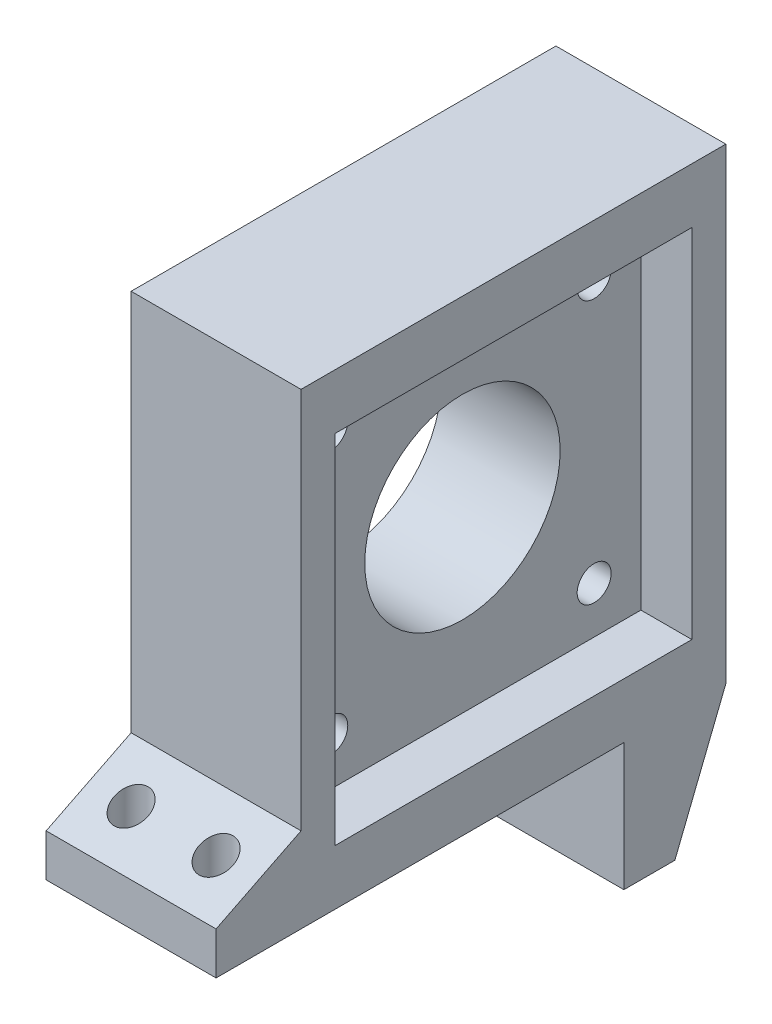
ISO-10303-21;
HEADER;
FILE_DESCRIPTION(('STEP AP214'),'2;1');
FILE_NAME('part.step','',(''),(''),'','','');
FILE_SCHEMA(('AUTOMOTIVE_DESIGN { 1 0 10303 214 1 1 1 1 }'));
ENDSEC;
DATA;
#1=APPLICATION_CONTEXT('core data for automotive mechanical design processes');
#2=APPLICATION_PROTOCOL_DEFINITION('international standard','automotive_design',2000,#1);
#3=PRODUCT_CONTEXT('',#1,'mechanical');
#4=PRODUCT('Part','Part','',(#3));
#5=PRODUCT_RELATED_PRODUCT_CATEGORY('part','',(#4));
#6=PRODUCT_DEFINITION_FORMATION('','',#4);
#7=PRODUCT_DEFINITION_CONTEXT('part definition',#1,'design');
#8=PRODUCT_DEFINITION('design','',#6,#7);
#9=PRODUCT_DEFINITION_SHAPE('','',#8);
#10=(LENGTH_UNIT() NAMED_UNIT(*) SI_UNIT(.MILLI.,.METRE.));
#11=(NAMED_UNIT(*) PLANE_ANGLE_UNIT() SI_UNIT($,.RADIAN.));
#12=(NAMED_UNIT(*) SI_UNIT($,.STERADIAN.) SOLID_ANGLE_UNIT());
#13=UNCERTAINTY_MEASURE_WITH_UNIT(LENGTH_MEASURE(1.E-05),#10,'distance_accuracy_value','');
#14=(GEOMETRIC_REPRESENTATION_CONTEXT(3) GLOBAL_UNCERTAINTY_ASSIGNED_CONTEXT((#13)) GLOBAL_UNIT_ASSIGNED_CONTEXT((#10,
#11,#12)) REPRESENTATION_CONTEXT('',''));
#15=CARTESIAN_POINT('',(0.,0.,0.));
#16=DIRECTION('',(0.,0.,1.));
#17=DIRECTION('',(1.,0.,0.));
#18=AXIS2_PLACEMENT_3D('',#15,#16,#17);
#19=CARTESIAN_POINT('',(0.,70.,50.));
#20=DIRECTION('',(0.,0.,-1.));
#21=DIRECTION('',(-1.,0.,0.));
#22=AXIS2_PLACEMENT_3D('',#19,#20,#21);
#23=PLANE('',#22);
#24=DIRECTION('',(0.,-1.,0.));
#25=VECTOR('',#24,1.);
#26=CARTESIAN_POINT('',(-20.,70.,50.));
#27=LINE('',#26,#25);
#28=CARTESIAN_POINT('',(-20.,70.,50.));
#29=VERTEX_POINT('',#28);
#30=CARTESIAN_POINT('',(-20.,25.,50.));
#31=VERTEX_POINT('',#30);
#32=EDGE_CURVE('E155',#29,#31,#27,.T.);
#33=ORIENTED_EDGE('',*,*,#32,.T.);
#34=DIRECTION('',(1.,0.,0.));
#35=VECTOR('',#34,1.);
#36=CARTESIAN_POINT('',(-20.,25.,50.));
#37=LINE('',#36,#35);
#38=CARTESIAN_POINT('',(0.,25.,50.));
#39=VERTEX_POINT('',#38);
#40=EDGE_CURVE('E135',#31,#39,#37,.T.);
#41=ORIENTED_EDGE('',*,*,#40,.T.);
#42=DIRECTION('',(0.,-1.,0.));
#43=VECTOR('',#42,1.);
#44=CARTESIAN_POINT('',(0.,70.,50.));
#45=LINE('',#44,#43);
#46=CARTESIAN_POINT('',(0.,70.,50.));
#47=VERTEX_POINT('',#46);
#48=EDGE_CURVE('E164',#47,#39,#45,.T.);
#49=ORIENTED_EDGE('',*,*,#48,.F.);
#50=DIRECTION('',(1.,0.,0.));
#51=VECTOR('',#50,1.);
#52=CARTESIAN_POINT('',(0.,70.,50.));
#53=LINE('',#52,#51);
#54=EDGE_CURVE('E161',#29,#47,#53,.T.);
#55=ORIENTED_EDGE('',*,*,#54,.F.);
#56=EDGE_LOOP('',(#33,#41,#49,#55));
#57=FACE_BOUND('',#56,.T.);
#58=ADVANCED_FACE('F39',(#57),#23,.F.);
#59=CARTESIAN_POINT('',(0.,70.,0.));
#60=DIRECTION('',(-1.,0.,0.));
#61=DIRECTION('',(0.,0.,1.));
#62=AXIS2_PLACEMENT_3D('',#59,#60,#61);
#63=PLANE('',#62);
#64=ORIENTED_EDGE('',*,*,#48,.T.);
#65=DIRECTION('',(0.,-0.447213595499958,0.894427190999916));
#66=VECTOR('',#65,1.);
#67=CARTESIAN_POINT('',(0.,20.,60.));
#68=LINE('',#67,#66);
#69=CARTESIAN_POINT('',(0.,20.,60.));
#70=VERTEX_POINT('',#69);
#71=EDGE_CURVE('E141',#39,#70,#68,.T.);
#72=ORIENTED_EDGE('',*,*,#71,.T.);
#73=DIRECTION('',(0.,1.,0.));
#74=VECTOR('',#73,1.);
#75=CARTESIAN_POINT('',(0.,15.,60.));
#76=LINE('',#75,#74);
#77=CARTESIAN_POINT('',(0.,15.,60.));
#78=VERTEX_POINT('',#77);
#79=EDGE_CURVE('E147',#78,#70,#76,.T.);
#80=ORIENTED_EDGE('',*,*,#79,.F.);
#81=DIRECTION('',(0.,0.,1.));
#82=VECTOR('',#81,1.);
#83=CARTESIAN_POINT('',(0.,15.,50.));
#84=LINE('',#83,#82);
#85=CARTESIAN_POINT('',(0.,15.,12.));
#86=VERTEX_POINT('',#85);
#87=EDGE_CURVE('E323',#86,#78,#84,.T.);
#88=ORIENTED_EDGE('',*,*,#87,.F.);
#89=DIRECTION('',(0.,1.,0.));
#90=VECTOR('',#89,1.);
#91=CARTESIAN_POINT('',(0.,0.,12.));
#92=LINE('',#91,#90);
#93=CARTESIAN_POINT('',(0.,0.,12.));
#94=VERTEX_POINT('',#93);
#95=EDGE_CURVE('E202',#94,#86,#92,.T.);
#96=ORIENTED_EDGE('',*,*,#95,.F.);
#97=DIRECTION('',(0.,0.,-1.));
#98=VECTOR('',#97,1.);
#99=CARTESIAN_POINT('',(0.,0.,0.));
#100=LINE('',#99,#98);
#101=CARTESIAN_POINT('',(0.,0.,6.));
#102=VERTEX_POINT('',#101);
#103=EDGE_CURVE('E196',#94,#102,#100,.T.);
#104=ORIENTED_EDGE('',*,*,#103,.T.);
#105=DIRECTION('',(0.,-0.928476690885259,0.371390676354103));
#106=VECTOR('',#105,1.);
#107=CARTESIAN_POINT('',(0.,15.,0.));
#108=LINE('',#107,#106);
#109=CARTESIAN_POINT('',(0.,15.,0.));
#110=VERTEX_POINT('',#109);
#111=EDGE_CURVE('E57',#110,#102,#108,.T.);
#112=ORIENTED_EDGE('',*,*,#111,.F.);
#113=DIRECTION('',(0.,-1.,0.));
#114=VECTOR('',#113,1.);
#115=CARTESIAN_POINT('',(0.,70.,0.));
#116=LINE('',#115,#114);
#117=CARTESIAN_POINT('',(0.,70.,0.));
#118=VERTEX_POINT('',#117);
#119=EDGE_CURVE('E49',#118,#110,#116,.T.);
#120=ORIENTED_EDGE('',*,*,#119,.F.);
#121=DIRECTION('',(0.,0.,-1.));
#122=VECTOR('',#121,1.);
#123=CARTESIAN_POINT('',(0.,70.,0.));
#124=LINE('',#123,#122);
#125=EDGE_CURVE('E335',#47,#118,#124,.T.);
#126=ORIENTED_EDGE('',*,*,#125,.F.);
#127=EDGE_LOOP('',(#64,#72,#80,#88,#96,#104,#112,#120,#126));
#128=FACE_BOUND('',#127,.T.);
#129=DIRECTION('',(0.,0.,1.));
#130=VECTOR('',#129,1.);
#131=CARTESIAN_POINT('',(0.,63.5,4.));
#132=LINE('',#131,#130);
#133=CARTESIAN_POINT('',(0.,63.5,4.));
#134=VERTEX_POINT('',#133);
#135=CARTESIAN_POINT('',(0.,63.5,46.));
#136=VERTEX_POINT('',#135);
#137=EDGE_CURVE('E285',#134,#136,#132,.T.);
#138=ORIENTED_EDGE('',*,*,#137,.F.);
#139=DIRECTION('',(0.,1.,0.));
#140=VECTOR('',#139,1.);
#141=CARTESIAN_POINT('',(0.,63.5,4.));
#142=LINE('',#141,#140);
#143=CARTESIAN_POINT('',(0.,21.5,3.99999999999999));
#144=VERTEX_POINT('',#143);
#145=EDGE_CURVE('E65',#144,#134,#142,.T.);
#146=ORIENTED_EDGE('',*,*,#145,.F.);
#147=DIRECTION('',(0.,0.,-1.));
#148=VECTOR('',#147,1.);
#149=CARTESIAN_POINT('',(0.,21.5,3.99999999999999));
#150=LINE('',#149,#148);
#151=CARTESIAN_POINT('',(0.,21.5,46.));
#152=VERTEX_POINT('',#151);
#153=EDGE_CURVE('E270',#152,#144,#150,.T.);
#154=ORIENTED_EDGE('',*,*,#153,.F.);
#155=DIRECTION('',(0.,-1.,0.));
#156=VECTOR('',#155,1.);
#157=CARTESIAN_POINT('',(0.,63.5,46.));
#158=LINE('',#157,#156);
#159=EDGE_CURVE('E289',#136,#152,#158,.T.);
#160=ORIENTED_EDGE('',*,*,#159,.F.);
#161=EDGE_LOOP('',(#138,#146,#154,#160));
#162=FACE_BOUND('',#161,.T.);
#163=ADVANCED_FACE('F41',(#128,#162),#63,.F.);
#164=CARTESIAN_POINT('',(0.,70.,0.));
#165=DIRECTION('',(0.,0.,1.));
#166=DIRECTION('',(1.,0.,0.));
#167=AXIS2_PLACEMENT_3D('',#164,#165,#166);
#168=PLANE('',#167);
#169=ORIENTED_EDGE('',*,*,#119,.T.);
#170=DIRECTION('',(1.,0.,0.));
#171=VECTOR('',#170,1.);
#172=CARTESIAN_POINT('',(-30.,15.,0.));
#173=LINE('',#172,#171);
#174=CARTESIAN_POINT('',(-20.,15.,0.));
#175=VERTEX_POINT('',#174);
#176=EDGE_CURVE('E214',#175,#110,#173,.T.);
#177=ORIENTED_EDGE('',*,*,#176,.F.);
#178=DIRECTION('',(0.,-1.,0.));
#179=VECTOR('',#178,1.);
#180=CARTESIAN_POINT('',(-20.,70.,0.));
#181=LINE('',#180,#179);
#182=CARTESIAN_POINT('',(-20.,70.,0.));
#183=VERTEX_POINT('',#182);
#184=EDGE_CURVE('E163',#183,#175,#181,.T.);
#185=ORIENTED_EDGE('',*,*,#184,.F.);
#186=DIRECTION('',(-1.,0.,0.));
#187=VECTOR('',#186,1.);
#188=CARTESIAN_POINT('',(0.,70.,0.));
#189=LINE('',#188,#187);
#190=EDGE_CURVE('E339',#118,#183,#189,.T.);
#191=ORIENTED_EDGE('',*,*,#190,.F.);
#192=EDGE_LOOP('',(#169,#177,#185,#191));
#193=FACE_BOUND('',#192,.T.);
#194=ADVANCED_FACE('F377',(#193),#168,.F.);
#195=CARTESIAN_POINT('',(-20.,70.,0.));
#196=DIRECTION('',(1.,0.,0.));
#197=DIRECTION('',(0.,0.,-1.));
#198=AXIS2_PLACEMENT_3D('',#195,#196,#197);
#199=PLANE('',#198);
#200=DIRECTION('',(0.,-0.447213595499958,0.894427190999916));
#201=VECTOR('',#200,1.);
#202=CARTESIAN_POINT('',(-20.,20.,60.));
#203=LINE('',#202,#201);
#204=CARTESIAN_POINT('',(-20.,20.,60.));
#205=VERTEX_POINT('',#204);
#206=EDGE_CURVE('E138',#31,#205,#203,.T.);
#207=ORIENTED_EDGE('',*,*,#206,.F.);
#208=ORIENTED_EDGE('',*,*,#32,.F.);
#209=DIRECTION('',(0.,0.,1.));
#210=VECTOR('',#209,1.);
#211=CARTESIAN_POINT('',(-20.,70.,0.));
#212=LINE('',#211,#210);
#213=EDGE_CURVE('E343',#183,#29,#212,.T.);
#214=ORIENTED_EDGE('',*,*,#213,.F.);
#215=ORIENTED_EDGE('',*,*,#184,.T.);
#216=DIRECTION('',(0.,-0.92847669088526,0.371390676354103));
#217=VECTOR('',#216,1.);
#218=CARTESIAN_POINT('',(-20.,62.4137931034483,-18.9655172413793));
#219=LINE('',#218,#217);
#220=CARTESIAN_POINT('',(-20.,0.,6.));
#221=VERTEX_POINT('',#220);
#222=EDGE_CURVE('E257',#175,#221,#219,.T.);
#223=ORIENTED_EDGE('',*,*,#222,.T.);
#224=DIRECTION('',(0.,0.,1.));
#225=VECTOR('',#224,1.);
#226=CARTESIAN_POINT('',(-20.,0.,0.));
#227=LINE('',#226,#225);
#228=CARTESIAN_POINT('',(-20.,0.,12.));
#229=VERTEX_POINT('',#228);
#230=EDGE_CURVE('E340',#221,#229,#227,.T.);
#231=ORIENTED_EDGE('',*,*,#230,.T.);
#232=DIRECTION('',(0.,1.,0.));
#233=VECTOR('',#232,1.);
#234=CARTESIAN_POINT('',(-20.,70.,12.));
#235=LINE('',#234,#233);
#236=CARTESIAN_POINT('',(-20.,15.,12.));
#237=VERTEX_POINT('',#236);
#238=EDGE_CURVE('E329',#229,#237,#235,.T.);
#239=ORIENTED_EDGE('',*,*,#238,.T.);
#240=DIRECTION('',(0.,0.,1.));
#241=VECTOR('',#240,1.);
#242=CARTESIAN_POINT('',(-20.,15.,0.));
#243=LINE('',#242,#241);
#244=CARTESIAN_POINT('',(-20.,15.,60.));
#245=VERTEX_POINT('',#244);
#246=EDGE_CURVE('E181',#237,#245,#243,.T.);
#247=ORIENTED_EDGE('',*,*,#246,.T.);
#248=DIRECTION('',(0.,-1.,0.));
#249=VECTOR('',#248,1.);
#250=CARTESIAN_POINT('',(-20.,15.,60.));
#251=LINE('',#250,#249);
#252=EDGE_CURVE('E158',#205,#245,#251,.T.);
#253=ORIENTED_EDGE('',*,*,#252,.F.);
#254=EDGE_LOOP('',(#207,#208,#214,#215,#223,#231,#239,#247,#253));
#255=FACE_BOUND('',#254,.T.);
#256=CARTESIAN_POINT('',(-20.,42.5,25.));
#257=DIRECTION('',(1.,0.,0.));
#258=DIRECTION('',(0.,0.,-1.));
#259=AXIS2_PLACEMENT_3D('',#256,#257,#258);
#260=CIRCLE('',#259,11.5);
#261=CARTESIAN_POINT('',(-20.,42.5,13.5));
#262=VERTEX_POINT('',#261);
#263=EDGE_CURVE('E193',#262,#262,#260,.T.);
#264=ORIENTED_EDGE('',*,*,#263,.T.);
#265=EDGE_LOOP('',(#264));
#266=FACE_BOUND('',#265,.T.);
#267=CARTESIAN_POINT('',(-20.,58.,40.5));
#268=DIRECTION('',(1.,0.,0.));
#269=DIRECTION('',(0.,0.,-1.));
#270=AXIS2_PLACEMENT_3D('',#267,#268,#269);
#271=CIRCLE('',#270,2.00000000000001);
#272=CARTESIAN_POINT('',(-20.,58.,38.5));
#273=VERTEX_POINT('',#272);
#274=EDGE_CURVE('E189',#273,#273,#271,.T.);
#275=ORIENTED_EDGE('',*,*,#274,.T.);
#276=EDGE_LOOP('',(#275));
#277=FACE_BOUND('',#276,.T.);
#278=CARTESIAN_POINT('',(-20.,27.,40.5));
#279=DIRECTION('',(1.,0.,0.));
#280=DIRECTION('',(0.,0.,-1.));
#281=AXIS2_PLACEMENT_3D('',#278,#279,#280);
#282=CIRCLE('',#281,2.);
#283=CARTESIAN_POINT('',(-20.,27.,38.5));
#284=VERTEX_POINT('',#283);
#285=EDGE_CURVE('E185',#284,#284,#282,.T.);
#286=ORIENTED_EDGE('',*,*,#285,.T.);
#287=EDGE_LOOP('',(#286));
#288=FACE_BOUND('',#287,.T.);
#289=CARTESIAN_POINT('',(-20.,27.,9.5));
#290=DIRECTION('',(1.,0.,0.));
#291=DIRECTION('',(0.,0.,-1.));
#292=AXIS2_PLACEMENT_3D('',#289,#290,#291);
#293=CIRCLE('',#292,2.00000000000001);
#294=CARTESIAN_POINT('',(-20.,27.,7.49999999999999));
#295=VERTEX_POINT('',#294);
#296=EDGE_CURVE('E180',#295,#295,#293,.T.);
#297=ORIENTED_EDGE('',*,*,#296,.T.);
#298=EDGE_LOOP('',(#297));
#299=FACE_BOUND('',#298,.T.);
#300=CARTESIAN_POINT('',(-20.,58.,9.5));
#301=DIRECTION('',(1.,0.,0.));
#302=DIRECTION('',(0.,0.,-1.));
#303=AXIS2_PLACEMENT_3D('',#300,#301,#302);
#304=CIRCLE('',#303,2.00000000000001);
#305=CARTESIAN_POINT('',(-20.,58.,7.5));
#306=VERTEX_POINT('',#305);
#307=EDGE_CURVE('E176',#306,#306,#304,.T.);
#308=ORIENTED_EDGE('',*,*,#307,.T.);
#309=EDGE_LOOP('',(#308));
#310=FACE_BOUND('',#309,.T.);
#311=ADVANCED_FACE('F152',(#255,#266,#277,#288,#299,#310),#199,.F.);
#312=CARTESIAN_POINT('',(0.,70.,0.));
#313=DIRECTION('',(0.,-1.,0.));
#314=DIRECTION('',(0.,0.,-1.));
#315=AXIS2_PLACEMENT_3D('',#312,#313,#314);
#316=PLANE('',#315);
#317=ORIENTED_EDGE('',*,*,#125,.T.);
#318=ORIENTED_EDGE('',*,*,#190,.T.);
#319=ORIENTED_EDGE('',*,*,#213,.T.);
#320=ORIENTED_EDGE('',*,*,#54,.T.);
#321=EDGE_LOOP('',(#317,#318,#319,#320));
#322=FACE_BOUND('',#321,.T.);
#323=ADVANCED_FACE('F373',(#322),#316,.F.);
#324=CARTESIAN_POINT('',(0.,0.,0.));
#325=DIRECTION('',(0.,-1.,0.));
#326=DIRECTION('',(0.,0.,-1.));
#327=AXIS2_PLACEMENT_3D('',#324,#325,#326);
#328=PLANE('',#327);
#329=DIRECTION('',(1.,0.,0.));
#330=VECTOR('',#329,1.);
#331=CARTESIAN_POINT('',(-30.,0.,6.));
#332=LINE('',#331,#330);
#333=EDGE_CURVE('E249',#221,#102,#332,.T.);
#334=ORIENTED_EDGE('',*,*,#333,.T.);
#335=ORIENTED_EDGE('',*,*,#103,.F.);
#336=DIRECTION('',(1.,0.,0.));
#337=VECTOR('',#336,1.);
#338=CARTESIAN_POINT('',(0.,0.,12.));
#339=LINE('',#338,#337);
#340=EDGE_CURVE('E11',#229,#94,#339,.T.);
#341=ORIENTED_EDGE('',*,*,#340,.F.);
#342=ORIENTED_EDGE('',*,*,#230,.F.);
#343=EDGE_LOOP('',(#334,#335,#341,#342));
#344=FACE_BOUND('',#343,.T.);
#345=ADVANCED_FACE('F360',(#344),#328,.T.);
#346=CARTESIAN_POINT('',(-60.,58.,9.50000000000001));
#347=DIRECTION('',(1.,0.,0.));
#348=DIRECTION('',(0.,0.,-1.));
#349=AXIS2_PLACEMENT_3D('',#346,#347,#348);
#350=CYLINDRICAL_SURFACE('',#349,2.00000000000001);
#351=CARTESIAN_POINT('',(-6.,58.,9.5));
#352=DIRECTION('',(-1.,0.,0.));
#353=DIRECTION('',(0.,0.,1.));
#354=AXIS2_PLACEMENT_3D('',#351,#352,#353);
#355=CIRCLE('',#354,2.00000000000001);
#356=CARTESIAN_POINT('',(-6.,58.,11.5));
#357=VERTEX_POINT('',#356);
#358=EDGE_CURVE('E203',#357,#357,#355,.F.);
#359=ORIENTED_EDGE('',*,*,#358,.T.);
#360=EDGE_LOOP('',(#359));
#361=FACE_BOUND('',#360,.T.);
#362=ORIENTED_EDGE('',*,*,#307,.F.);
#363=EDGE_LOOP('',(#362));
#364=FACE_BOUND('',#363,.T.);
#365=ADVANCED_FACE('F423',(#361,#364),#350,.F.);
#366=CARTESIAN_POINT('',(-60.,27.,9.50000000000001));
#367=DIRECTION('',(1.,0.,0.));
#368=DIRECTION('',(0.,0.,-1.));
#369=AXIS2_PLACEMENT_3D('',#366,#367,#368);
#370=CYLINDRICAL_SURFACE('',#369,2.00000000000001);
#371=CARTESIAN_POINT('',(-6.,27.,9.5));
#372=DIRECTION('',(-1.,0.,0.));
#373=DIRECTION('',(0.,0.,1.));
#374=AXIS2_PLACEMENT_3D('',#371,#372,#373);
#375=CIRCLE('',#374,2.00000000000001);
#376=CARTESIAN_POINT('',(-6.,27.,11.5));
#377=VERTEX_POINT('',#376);
#378=EDGE_CURVE('E313',#377,#377,#375,.F.);
#379=ORIENTED_EDGE('',*,*,#378,.T.);
#380=EDGE_LOOP('',(#379));
#381=FACE_BOUND('',#380,.T.);
#382=ORIENTED_EDGE('',*,*,#296,.F.);
#383=EDGE_LOOP('',(#382));
#384=FACE_BOUND('',#383,.T.);
#385=ADVANCED_FACE('F510',(#381,#384),#370,.F.);
#386=CARTESIAN_POINT('',(-60.,27.,40.5));
#387=DIRECTION('',(1.,0.,0.));
#388=DIRECTION('',(0.,0.,-1.));
#389=AXIS2_PLACEMENT_3D('',#386,#387,#388);
#390=CYLINDRICAL_SURFACE('',#389,2.);
#391=CARTESIAN_POINT('',(-5.99999999999999,27.,40.5));
#392=DIRECTION('',(-1.,0.,0.));
#393=DIRECTION('',(0.,0.,1.));
#394=AXIS2_PLACEMENT_3D('',#391,#392,#393);
#395=CIRCLE('',#394,2.);
#396=CARTESIAN_POINT('',(-5.99999999999999,27.,42.5));
#397=VERTEX_POINT('',#396);
#398=EDGE_CURVE('E309',#397,#397,#395,.F.);
#399=ORIENTED_EDGE('',*,*,#398,.T.);
#400=EDGE_LOOP('',(#399));
#401=FACE_BOUND('',#400,.T.);
#402=ORIENTED_EDGE('',*,*,#285,.F.);
#403=EDGE_LOOP('',(#402));
#404=FACE_BOUND('',#403,.T.);
#405=ADVANCED_FACE('F500',(#401,#404),#390,.F.);
#406=CARTESIAN_POINT('',(-60.,58.,40.5));
#407=DIRECTION('',(1.,0.,0.));
#408=DIRECTION('',(0.,0.,-1.));
#409=AXIS2_PLACEMENT_3D('',#406,#407,#408);
#410=CYLINDRICAL_SURFACE('',#409,2.00000000000001);
#411=CARTESIAN_POINT('',(-5.99999999999999,58.,40.5));
#412=DIRECTION('',(-1.,0.,0.));
#413=DIRECTION('',(0.,0.,1.));
#414=AXIS2_PLACEMENT_3D('',#411,#412,#413);
#415=CIRCLE('',#414,2.00000000000001);
#416=CARTESIAN_POINT('',(-5.99999999999999,58.,42.5));
#417=VERTEX_POINT('',#416);
#418=EDGE_CURVE('E208',#417,#417,#415,.F.);
#419=ORIENTED_EDGE('',*,*,#418,.T.);
#420=EDGE_LOOP('',(#419));
#421=FACE_BOUND('',#420,.T.);
#422=ORIENTED_EDGE('',*,*,#274,.F.);
#423=EDGE_LOOP('',(#422));
#424=FACE_BOUND('',#423,.T.);
#425=ADVANCED_FACE('F489',(#421,#424),#410,.F.);
#426=CARTESIAN_POINT('',(-60.,42.5,25.));
#427=DIRECTION('',(1.,0.,0.));
#428=DIRECTION('',(0.,0.,-1.));
#429=AXIS2_PLACEMENT_3D('',#426,#427,#428);
#430=CYLINDRICAL_SURFACE('',#429,11.5);
#431=CARTESIAN_POINT('',(-6.,42.5,25.));
#432=DIRECTION('',(-1.,0.,0.));
#433=DIRECTION('',(0.,0.,1.));
#434=AXIS2_PLACEMENT_3D('',#431,#432,#433);
#435=CIRCLE('',#434,11.5);
#436=CARTESIAN_POINT('',(-6.,42.5,36.5));
#437=VERTEX_POINT('',#436);
#438=EDGE_CURVE('E204',#437,#437,#435,.F.);
#439=ORIENTED_EDGE('',*,*,#438,.T.);
#440=EDGE_LOOP('',(#439));
#441=FACE_BOUND('',#440,.T.);
#442=ORIENTED_EDGE('',*,*,#263,.F.);
#443=EDGE_LOOP('',(#442));
#444=FACE_BOUND('',#443,.T.);
#445=ADVANCED_FACE('F484',(#441,#444),#430,.F.);
#446=CARTESIAN_POINT('',(-60.,15.,50.));
#447=DIRECTION('',(0.,1.,0.));
#448=DIRECTION('',(0.,0.,1.));
#449=AXIS2_PLACEMENT_3D('',#446,#447,#448);
#450=PLANE('',#449);
#451=CARTESIAN_POINT('',(-5.,15.,55.));
#452=DIRECTION('',(0.,-1.,0.));
#453=DIRECTION('',(0.,0.,-1.));
#454=AXIS2_PLACEMENT_3D('',#451,#452,#453);
#455=CIRCLE('',#454,2.);
#456=CARTESIAN_POINT('',(-5.,15.,53.));
#457=VERTEX_POINT('',#456);
#458=EDGE_CURVE('E218',#457,#457,#455,.T.);
#459=ORIENTED_EDGE('',*,*,#458,.F.);
#460=EDGE_LOOP('',(#459));
#461=FACE_BOUND('',#460,.T.);
#462=CARTESIAN_POINT('',(-15.,15.,55.));
#463=DIRECTION('',(0.,-1.,0.));
#464=DIRECTION('',(0.,0.,-1.));
#465=AXIS2_PLACEMENT_3D('',#462,#463,#464);
#466=CIRCLE('',#465,2.);
#467=CARTESIAN_POINT('',(-15.,15.,53.));
#468=VERTEX_POINT('',#467);
#469=EDGE_CURVE('E225',#468,#468,#466,.T.);
#470=ORIENTED_EDGE('',*,*,#469,.F.);
#471=EDGE_LOOP('',(#470));
#472=FACE_BOUND('',#471,.T.);
#473=DIRECTION('',(1.,0.,0.));
#474=VECTOR('',#473,1.);
#475=CARTESIAN_POINT('',(-60.,15.,12.));
#476=LINE('',#475,#474);
#477=EDGE_CURVE('E326',#237,#86,#476,.T.);
#478=ORIENTED_EDGE('',*,*,#477,.T.);
#479=ORIENTED_EDGE('',*,*,#87,.T.);
#480=DIRECTION('',(1.,0.,0.));
#481=VECTOR('',#480,1.);
#482=CARTESIAN_POINT('',(0.,15.,60.));
#483=LINE('',#482,#481);
#484=EDGE_CURVE('E243',#245,#78,#483,.T.);
#485=ORIENTED_EDGE('',*,*,#484,.F.);
#486=ORIENTED_EDGE('',*,*,#246,.F.);
#487=EDGE_LOOP('',(#478,#479,#485,#486));
#488=FACE_BOUND('',#487,.T.);
#489=ADVANCED_FACE('F368',(#461,#472,#488),#450,.F.);
#490=CARTESIAN_POINT('',(-60.,0.,12.));
#491=DIRECTION('',(0.,0.,-1.));
#492=DIRECTION('',(-1.,0.,0.));
#493=AXIS2_PLACEMENT_3D('',#490,#491,#492);
#494=PLANE('',#493);
#495=CARTESIAN_POINT('',(-15.,6.,12.));
#496=DIRECTION('',(0.,0.,-1.));
#497=DIRECTION('',(-1.,0.,0.));
#498=AXIS2_PLACEMENT_3D('',#495,#496,#497);
#499=CIRCLE('',#498,2.);
#500=CARTESIAN_POINT('',(-17.,6.,12.));
#501=VERTEX_POINT('',#500);
#502=EDGE_CURVE('E198',#501,#501,#499,.T.);
#503=ORIENTED_EDGE('',*,*,#502,.T.);
#504=EDGE_LOOP('',(#503));
#505=FACE_BOUND('',#504,.T.);
#506=ORIENTED_EDGE('',*,*,#340,.T.);
#507=ORIENTED_EDGE('',*,*,#95,.T.);
#508=ORIENTED_EDGE('',*,*,#477,.F.);
#509=ORIENTED_EDGE('',*,*,#238,.F.);
#510=EDGE_LOOP('',(#506,#507,#508,#509));
#511=FACE_BOUND('',#510,.T.);
#512=ADVANCED_FACE('F357',(#505,#511),#494,.F.);
#513=CARTESIAN_POINT('',(-15.,6.,15.));
#514=DIRECTION('',(0.,0.,-1.));
#515=DIRECTION('',(-1.,0.,0.));
#516=AXIS2_PLACEMENT_3D('',#513,#514,#515);
#517=CYLINDRICAL_SURFACE('',#516,2.);
#518=CARTESIAN_POINT('',(-15.,6.,3.6));
#519=DIRECTION('',(0.,0.371390676354103,0.928476690885259));
#520=DIRECTION('',(0.,0.92847669088526,-0.371390676354103));
#521=AXIS2_PLACEMENT_3D('',#518,#519,#520);
#522=ELLIPSE('',#521,2.1540659228538,2.);
#523=CARTESIAN_POINT('',(-15.,8.,2.8));
#524=VERTEX_POINT('',#523);
#525=EDGE_CURVE('E213',#524,#524,#522,.F.);
#526=ORIENTED_EDGE('',*,*,#525,.T.);
#527=EDGE_LOOP('',(#526));
#528=FACE_BOUND('',#527,.T.);
#529=ORIENTED_EDGE('',*,*,#502,.F.);
#530=EDGE_LOOP('',(#529));
#531=FACE_BOUND('',#530,.T.);
#532=ADVANCED_FACE('F427',(#528,#531),#517,.F.);
#533=CARTESIAN_POINT('',(-6.,0.,0.));
#534=DIRECTION('',(-1.,0.,0.));
#535=DIRECTION('',(0.,0.,1.));
#536=AXIS2_PLACEMENT_3D('',#533,#534,#535);
#537=PLANE('',#536);
#538=ORIENTED_EDGE('',*,*,#378,.F.);
#539=EDGE_LOOP('',(#538));
#540=FACE_BOUND('',#539,.T.);
#541=ORIENTED_EDGE('',*,*,#418,.F.);
#542=EDGE_LOOP('',(#541));
#543=FACE_BOUND('',#542,.T.);
#544=DIRECTION('',(0.,1.,0.));
#545=VECTOR('',#544,1.);
#546=CARTESIAN_POINT('',(-6.,63.5,4.));
#547=LINE('',#546,#545);
#548=CARTESIAN_POINT('',(-6.,21.5,3.99999999999999));
#549=VERTEX_POINT('',#548);
#550=CARTESIAN_POINT('',(-6.,63.5,4.));
#551=VERTEX_POINT('',#550);
#552=EDGE_CURVE('E265',#549,#551,#547,.T.);
#553=ORIENTED_EDGE('',*,*,#552,.T.);
#554=DIRECTION('',(0.,0.,1.));
#555=VECTOR('',#554,1.);
#556=CARTESIAN_POINT('',(-6.,63.5,4.));
#557=LINE('',#556,#555);
#558=CARTESIAN_POINT('',(-5.99999999999999,63.5,46.));
#559=VERTEX_POINT('',#558);
#560=EDGE_CURVE('E269',#551,#559,#557,.T.);
#561=ORIENTED_EDGE('',*,*,#560,.T.);
#562=DIRECTION('',(0.,-1.,0.));
#563=VECTOR('',#562,1.);
#564=CARTESIAN_POINT('',(-5.99999999999999,63.5,46.));
#565=LINE('',#564,#563);
#566=CARTESIAN_POINT('',(-5.99999999999999,21.5,46.));
#567=VERTEX_POINT('',#566);
#568=EDGE_CURVE('E274',#559,#567,#565,.T.);
#569=ORIENTED_EDGE('',*,*,#568,.T.);
#570=DIRECTION('',(0.,0.,-1.));
#571=VECTOR('',#570,1.);
#572=CARTESIAN_POINT('',(-6.,21.5,3.99999999999999));
#573=LINE('',#572,#571);
#574=EDGE_CURVE('E278',#567,#549,#573,.T.);
#575=ORIENTED_EDGE('',*,*,#574,.T.);
#576=EDGE_LOOP('',(#553,#561,#569,#575));
#577=FACE_BOUND('',#576,.T.);
#578=ORIENTED_EDGE('',*,*,#438,.F.);
#579=EDGE_LOOP('',(#578));
#580=FACE_BOUND('',#579,.T.);
#581=ORIENTED_EDGE('',*,*,#398,.F.);
#582=EDGE_LOOP('',(#581));
#583=FACE_BOUND('',#582,.T.);
#584=ORIENTED_EDGE('',*,*,#358,.F.);
#585=EDGE_LOOP('',(#584));
#586=FACE_BOUND('',#585,.T.);
#587=ADVANCED_FACE('F430',(#540,#543,#577,#580,#583,#586),#537,.F.);
#588=CARTESIAN_POINT('',(-6.,63.5,4.));
#589=DIRECTION('',(0.,0.,-1.));
#590=DIRECTION('',(0.,1.,0.));
#591=AXIS2_PLACEMENT_3D('',#588,#589,#590);
#592=PLANE('',#591);
#593=ORIENTED_EDGE('',*,*,#145,.T.);
#594=DIRECTION('',(1.,0.,0.));
#595=VECTOR('',#594,1.);
#596=CARTESIAN_POINT('',(-6.,63.5,4.));
#597=LINE('',#596,#595);
#598=EDGE_CURVE('E282',#551,#134,#597,.T.);
#599=ORIENTED_EDGE('',*,*,#598,.F.);
#600=ORIENTED_EDGE('',*,*,#552,.F.);
#601=DIRECTION('',(1.,0.,0.));
#602=VECTOR('',#601,1.);
#603=CARTESIAN_POINT('',(-6.,21.5,3.99999999999999));
#604=LINE('',#603,#602);
#605=EDGE_CURVE('E209',#549,#144,#604,.T.);
#606=ORIENTED_EDGE('',*,*,#605,.T.);
#607=EDGE_LOOP('',(#593,#599,#600,#606));
#608=FACE_BOUND('',#607,.T.);
#609=ADVANCED_FACE('F465',(#608),#592,.F.);
#610=CARTESIAN_POINT('',(-6.,21.5,3.99999999999999));
#611=DIRECTION('',(0.,-1.,0.));
#612=DIRECTION('',(0.,0.,-1.));
#613=AXIS2_PLACEMENT_3D('',#610,#611,#612);
#614=PLANE('',#613);
#615=ORIENTED_EDGE('',*,*,#153,.T.);
#616=ORIENTED_EDGE('',*,*,#605,.F.);
#617=ORIENTED_EDGE('',*,*,#574,.F.);
#618=DIRECTION('',(1.,0.,0.));
#619=VECTOR('',#618,1.);
#620=CARTESIAN_POINT('',(-5.99999999999999,21.5,46.));
#621=LINE('',#620,#619);
#622=EDGE_CURVE('E298',#567,#152,#621,.T.);
#623=ORIENTED_EDGE('',*,*,#622,.T.);
#624=EDGE_LOOP('',(#615,#616,#617,#623));
#625=FACE_BOUND('',#624,.T.);
#626=ADVANCED_FACE('F457',(#625),#614,.F.);
#627=CARTESIAN_POINT('',(-5.99999999999999,63.5,46.));
#628=DIRECTION('',(0.,0.,1.));
#629=DIRECTION('',(0.,-1.,0.));
#630=AXIS2_PLACEMENT_3D('',#627,#628,#629);
#631=PLANE('',#630);
#632=ORIENTED_EDGE('',*,*,#159,.T.);
#633=ORIENTED_EDGE('',*,*,#622,.F.);
#634=ORIENTED_EDGE('',*,*,#568,.F.);
#635=DIRECTION('',(1.,0.,0.));
#636=VECTOR('',#635,1.);
#637=CARTESIAN_POINT('',(-5.99999999999999,63.5,46.));
#638=LINE('',#637,#636);
#639=EDGE_CURVE('E301',#559,#136,#638,.T.);
#640=ORIENTED_EDGE('',*,*,#639,.T.);
#641=EDGE_LOOP('',(#632,#633,#634,#640));
#642=FACE_BOUND('',#641,.T.);
#643=ADVANCED_FACE('F392',(#642),#631,.F.);
#644=CARTESIAN_POINT('',(-6.,63.5,4.));
#645=DIRECTION('',(0.,1.,0.));
#646=DIRECTION('',(0.,0.,1.));
#647=AXIS2_PLACEMENT_3D('',#644,#645,#646);
#648=PLANE('',#647);
#649=ORIENTED_EDGE('',*,*,#137,.T.);
#650=ORIENTED_EDGE('',*,*,#639,.F.);
#651=ORIENTED_EDGE('',*,*,#560,.F.);
#652=ORIENTED_EDGE('',*,*,#598,.T.);
#653=EDGE_LOOP('',(#649,#650,#651,#652));
#654=FACE_BOUND('',#653,.T.);
#655=ADVANCED_FACE('F381',(#654),#648,.F.);
#656=CARTESIAN_POINT('',(-30.,15.,0.));
#657=DIRECTION('',(0.,0.371390676354103,0.928476690885259));
#658=DIRECTION('',(0.,-0.92847669088526,0.371390676354103));
#659=AXIS2_PLACEMENT_3D('',#656,#657,#658);
#660=PLANE('',#659);
#661=CARTESIAN_POINT('',(-5.,6.,3.6));
#662=DIRECTION('',(0.,0.371390676354103,0.928476690885259));
#663=DIRECTION('',(0.,0.92847669088526,-0.371390676354103));
#664=AXIS2_PLACEMENT_3D('',#661,#662,#663);
#665=ELLIPSE('',#664,2.1540659228538,2.);
#666=CARTESIAN_POINT('',(-5.,8.,2.8));
#667=VERTEX_POINT('',#666);
#668=EDGE_CURVE('E210',#667,#667,#665,.F.);
#669=ORIENTED_EDGE('',*,*,#668,.F.);
#670=EDGE_LOOP('',(#669));
#671=FACE_BOUND('',#670,.T.);
#672=ORIENTED_EDGE('',*,*,#525,.F.);
#673=EDGE_LOOP('',(#672));
#674=FACE_BOUND('',#673,.T.);
#675=ORIENTED_EDGE('',*,*,#176,.T.);
#676=ORIENTED_EDGE('',*,*,#111,.T.);
#677=ORIENTED_EDGE('',*,*,#333,.F.);
#678=ORIENTED_EDGE('',*,*,#222,.F.);
#679=EDGE_LOOP('',(#675,#676,#677,#678));
#680=FACE_BOUND('',#679,.T.);
#681=ADVANCED_FACE('F378',(#671,#674,#680),#660,.F.);
#682=CARTESIAN_POINT('',(-5.,6.,7.));
#683=DIRECTION('',(0.,0.,-1.));
#684=DIRECTION('',(-1.,0.,0.));
#685=AXIS2_PLACEMENT_3D('',#682,#683,#684);
#686=PLANE('',#685);
#687=CARTESIAN_POINT('',(-5.,6.,7.));
#688=DIRECTION('',(0.,0.,-1.));
#689=DIRECTION('',(-1.,0.,0.));
#690=AXIS2_PLACEMENT_3D('',#687,#688,#689);
#691=CIRCLE('',#690,2.);
#692=CARTESIAN_POINT('',(-7.,6.,7.));
#693=VERTEX_POINT('',#692);
#694=EDGE_CURVE('E261',#693,#693,#691,.T.);
#695=ORIENTED_EDGE('',*,*,#694,.T.);
#696=EDGE_LOOP('',(#695));
#697=FACE_BOUND('',#696,.T.);
#698=ADVANCED_FACE('F380',(#697),#686,.T.);
#699=CARTESIAN_POINT('',(-5.,6.,7.));
#700=DIRECTION('',(0.,0.,-1.));
#701=DIRECTION('',(-1.,0.,0.));
#702=AXIS2_PLACEMENT_3D('',#699,#700,#701);
#703=CYLINDRICAL_SURFACE('',#702,2.);
#704=ORIENTED_EDGE('',*,*,#668,.T.);
#705=EDGE_LOOP('',(#704));
#706=FACE_BOUND('',#705,.T.);
#707=ORIENTED_EDGE('',*,*,#694,.F.);
#708=EDGE_LOOP('',(#707));
#709=FACE_BOUND('',#708,.T.);
#710=ADVANCED_FACE('F388',(#706,#709),#703,.F.);
#711=CARTESIAN_POINT('',(0.,0.,60.));
#712=DIRECTION('',(0.,0.,1.));
#713=DIRECTION('',(1.,0.,0.));
#714=AXIS2_PLACEMENT_3D('',#711,#712,#713);
#715=PLANE('',#714);
#716=ORIENTED_EDGE('',*,*,#79,.T.);
#717=DIRECTION('',(-1.,0.,0.));
#718=VECTOR('',#717,1.);
#719=CARTESIAN_POINT('',(0.,20.,60.));
#720=LINE('',#719,#718);
#721=EDGE_CURVE('E238',#70,#205,#720,.T.);
#722=ORIENTED_EDGE('',*,*,#721,.T.);
#723=ORIENTED_EDGE('',*,*,#252,.T.);
#724=ORIENTED_EDGE('',*,*,#484,.T.);
#725=EDGE_LOOP('',(#716,#722,#723,#724));
#726=FACE_BOUND('',#725,.T.);
#727=ADVANCED_FACE('F370',(#726),#715,.T.);
#728=CARTESIAN_POINT('',(-20.,20.,60.));
#729=DIRECTION('',(0.,0.894427190999916,0.447213595499958));
#730=DIRECTION('',(0.,-0.447213595499958,0.894427190999916));
#731=AXIS2_PLACEMENT_3D('',#728,#729,#730);
#732=PLANE('',#731);
#733=CARTESIAN_POINT('',(-5.,22.5,55.));
#734=DIRECTION('',(0.,0.894427190999916,0.447213595499958));
#735=DIRECTION('',(0.,-0.447213595499958,0.894427190999916));
#736=AXIS2_PLACEMENT_3D('',#733,#734,#735);
#737=ELLIPSE('',#736,2.23606797749979,2.);
#738=CARTESIAN_POINT('',(-5.,21.5,57.));
#739=VERTEX_POINT('',#738);
#740=EDGE_CURVE('E43',#739,#739,#737,.T.);
#741=ORIENTED_EDGE('',*,*,#740,.F.);
#742=EDGE_LOOP('',(#741));
#743=FACE_BOUND('',#742,.T.);
#744=CARTESIAN_POINT('',(-15.,22.5,55.));
#745=DIRECTION('',(0.,0.894427190999916,0.447213595499958));
#746=DIRECTION('',(0.,-0.447213595499958,0.894427190999916));
#747=AXIS2_PLACEMENT_3D('',#744,#745,#746);
#748=ELLIPSE('',#747,2.23606797749979,2.);
#749=CARTESIAN_POINT('',(-15.,21.5,57.));
#750=VERTEX_POINT('',#749);
#751=EDGE_CURVE('E215',#750,#750,#748,.T.);
#752=ORIENTED_EDGE('',*,*,#751,.F.);
#753=EDGE_LOOP('',(#752));
#754=FACE_BOUND('',#753,.T.);
#755=ORIENTED_EDGE('',*,*,#71,.F.);
#756=ORIENTED_EDGE('',*,*,#40,.F.);
#757=ORIENTED_EDGE('',*,*,#206,.T.);
#758=ORIENTED_EDGE('',*,*,#721,.F.);
#759=EDGE_LOOP('',(#755,#756,#757,#758));
#760=FACE_BOUND('',#759,.T.);
#761=ADVANCED_FACE('F137',(#743,#754,#760),#732,.T.);
#762=CARTESIAN_POINT('',(-15.,25.,55.));
#763=DIRECTION('',(0.,-1.,0.));
#764=DIRECTION('',(0.,0.,-1.));
#765=AXIS2_PLACEMENT_3D('',#762,#763,#764);
#766=CYLINDRICAL_SURFACE('',#765,2.);
#767=ORIENTED_EDGE('',*,*,#751,.T.);
#768=EDGE_LOOP('',(#767));
#769=FACE_BOUND('',#768,.T.);
#770=ORIENTED_EDGE('',*,*,#469,.T.);
#771=EDGE_LOOP('',(#770));
#772=FACE_BOUND('',#771,.T.);
#773=ADVANCED_FACE('F590',(#769,#772),#766,.F.);
#774=CARTESIAN_POINT('',(-5.,25.,55.));
#775=DIRECTION('',(0.,-1.,0.));
#776=DIRECTION('',(0.,0.,-1.));
#777=AXIS2_PLACEMENT_3D('',#774,#775,#776);
#778=CYLINDRICAL_SURFACE('',#777,2.);
#779=ORIENTED_EDGE('',*,*,#740,.T.);
#780=EDGE_LOOP('',(#779));
#781=FACE_BOUND('',#780,.T.);
#782=ORIENTED_EDGE('',*,*,#458,.T.);
#783=EDGE_LOOP('',(#782));
#784=FACE_BOUND('',#783,.T.);
#785=ADVANCED_FACE('F598',(#781,#784),#778,.F.);
#786=CLOSED_SHELL('',(#58,#163,#194,#311,#323,#345,#365,#385,#405,#425,#445,#489,#512,#532,#587,
#609,#626,#643,#655,#681,#698,#710,#727,#761,#773,#785));
#787=MANIFOLD_SOLID_BREP('B2',#786);
#788=ADVANCED_BREP_SHAPE_REPRESENTATION('',(#18,#787),#14);
#789=SHAPE_DEFINITION_REPRESENTATION(#9,#788);
ENDSEC;
END-ISO-10303-21;
